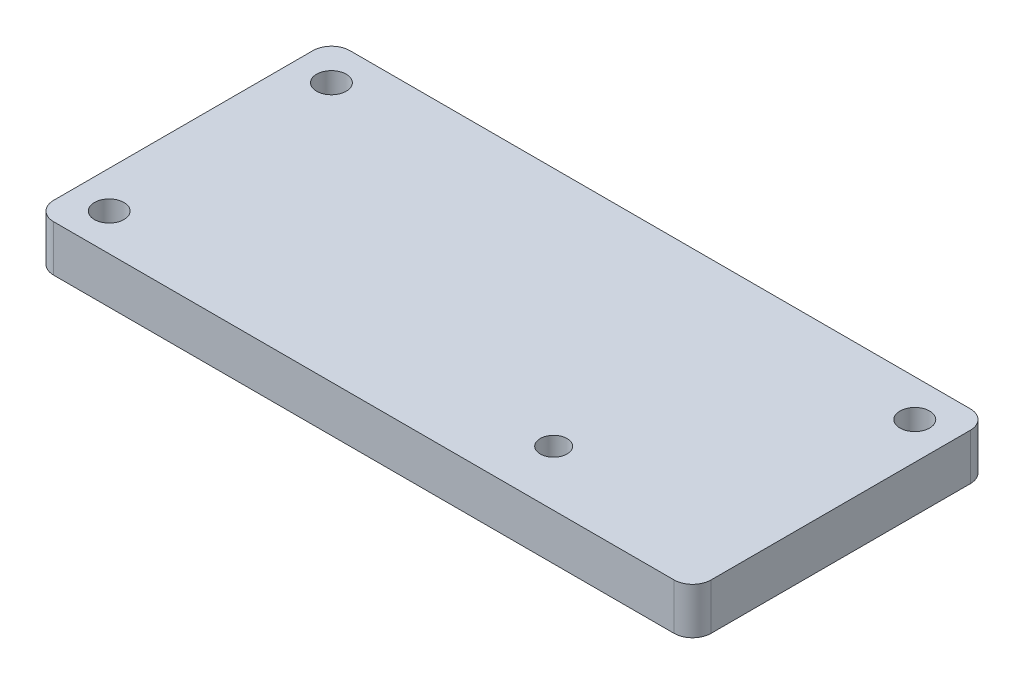
ISO-10303-21;
HEADER;
FILE_DESCRIPTION(('STEP AP214'),'2;1');
FILE_NAME('part.step','',(''),(''),'','','');
FILE_SCHEMA(('AUTOMOTIVE_DESIGN { 1 0 10303 214 1 1 1 1 }'));
ENDSEC;
DATA;
#1=APPLICATION_CONTEXT('core data for automotive mechanical design processes');
#2=APPLICATION_PROTOCOL_DEFINITION('international standard','automotive_design',2000,#1);
#3=PRODUCT_CONTEXT('',#1,'mechanical');
#4=PRODUCT('Part','Part','',(#3));
#5=PRODUCT_RELATED_PRODUCT_CATEGORY('part','',(#4));
#6=PRODUCT_DEFINITION_FORMATION('','',#4);
#7=PRODUCT_DEFINITION_CONTEXT('part definition',#1,'design');
#8=PRODUCT_DEFINITION('design','',#6,#7);
#9=PRODUCT_DEFINITION_SHAPE('','',#8);
#10=(LENGTH_UNIT() NAMED_UNIT(*) SI_UNIT(.MILLI.,.METRE.));
#11=(NAMED_UNIT(*) PLANE_ANGLE_UNIT() SI_UNIT($,.RADIAN.));
#12=(NAMED_UNIT(*) SI_UNIT($,.STERADIAN.) SOLID_ANGLE_UNIT());
#13=UNCERTAINTY_MEASURE_WITH_UNIT(LENGTH_MEASURE(1.E-05),#10,'distance_accuracy_value','');
#14=(GEOMETRIC_REPRESENTATION_CONTEXT(3) GLOBAL_UNCERTAINTY_ASSIGNED_CONTEXT((#13)) GLOBAL_UNIT_ASSIGNED_CONTEXT((#10,
#11,#12)) REPRESENTATION_CONTEXT('',''));
#15=CARTESIAN_POINT('',(0.,0.,0.));
#16=DIRECTION('',(0.,0.,1.));
#17=DIRECTION('',(1.,0.,0.));
#18=AXIS2_PLACEMENT_3D('',#15,#16,#17);
#19=CARTESIAN_POINT('',(0.,5.,0.));
#20=DIRECTION('',(0.,-1.,0.));
#21=DIRECTION('',(0.,0.,-1.));
#22=AXIS2_PLACEMENT_3D('',#19,#20,#21);
#23=PLANE('',#22);
#24=CARTESIAN_POINT('',(31.5,5.,-12.));
#25=DIRECTION('',(0.,1.,0.));
#26=DIRECTION('',(0.,0.,1.));
#27=AXIS2_PLACEMENT_3D('',#24,#25,#26);
#28=CIRCLE('',#27,1.6);
#29=CARTESIAN_POINT('',(31.5,5.,-10.4));
#30=VERTEX_POINT('',#29);
#31=EDGE_CURVE('E230',#30,#30,#28,.T.);
#32=ORIENTED_EDGE('',*,*,#31,.F.);
#33=EDGE_LOOP('',(#32));
#34=FACE_BOUND('',#33,.T.);
#35=CARTESIAN_POINT('',(-31.5,5.,12.));
#36=DIRECTION('',(0.,1.,0.));
#37=DIRECTION('',(0.,0.,1.));
#38=AXIS2_PLACEMENT_3D('',#35,#36,#37);
#39=CIRCLE('',#38,1.6);
#40=CARTESIAN_POINT('',(-31.5,5.,13.6));
#41=VERTEX_POINT('',#40);
#42=EDGE_CURVE('E218',#41,#41,#39,.T.);
#43=ORIENTED_EDGE('',*,*,#42,.F.);
#44=EDGE_LOOP('',(#43));
#45=FACE_BOUND('',#44,.T.);
#46=CARTESIAN_POINT('',(-31.5,5.,-12.));
#47=DIRECTION('',(0.,1.,0.));
#48=DIRECTION('',(0.,0.,1.));
#49=AXIS2_PLACEMENT_3D('',#46,#47,#48);
#50=CIRCLE('',#49,1.6);
#51=CARTESIAN_POINT('',(-31.5,5.,-10.4));
#52=VERTEX_POINT('',#51);
#53=EDGE_CURVE('E213',#52,#52,#50,.T.);
#54=ORIENTED_EDGE('',*,*,#53,.F.);
#55=EDGE_LOOP('',(#54));
#56=FACE_BOUND('',#55,.T.);
#57=DIRECTION('',(1.,0.,0.));
#58=VECTOR('',#57,1.);
#59=CARTESIAN_POINT('',(-35.5,5.,16.));
#60=LINE('',#59,#58);
#61=CARTESIAN_POINT('',(-33.5,5.,16.));
#62=VERTEX_POINT('',#61);
#63=CARTESIAN_POINT('',(33.5,5.,16.));
#64=VERTEX_POINT('',#63);
#65=EDGE_CURVE('E149',#62,#64,#60,.T.);
#66=ORIENTED_EDGE('',*,*,#65,.T.);
#67=CARTESIAN_POINT('',(33.5,5.,14.));
#68=DIRECTION('',(0.,-1.,0.));
#69=DIRECTION('',(0.,0.,-1.));
#70=AXIS2_PLACEMENT_3D('',#67,#68,#69);
#71=CIRCLE('',#70,2.);
#72=CARTESIAN_POINT('',(35.5,5.,14.));
#73=VERTEX_POINT('',#72);
#74=EDGE_CURVE('E172',#64,#73,#71,.F.);
#75=ORIENTED_EDGE('',*,*,#74,.T.);
#76=DIRECTION('',(0.,0.,-1.));
#77=VECTOR('',#76,1.);
#78=CARTESIAN_POINT('',(35.5,5.,16.));
#79=LINE('',#78,#77);
#80=CARTESIAN_POINT('',(35.5,5.,-14.));
#81=VERTEX_POINT('',#80);
#82=EDGE_CURVE('E132',#73,#81,#79,.T.);
#83=ORIENTED_EDGE('',*,*,#82,.T.);
#84=CARTESIAN_POINT('',(33.5,5.,-14.));
#85=DIRECTION('',(0.,-1.,0.));
#86=DIRECTION('',(0.,0.,-1.));
#87=AXIS2_PLACEMENT_3D('',#84,#85,#86);
#88=CIRCLE('',#87,2.);
#89=CARTESIAN_POINT('',(33.5,5.,-16.));
#90=VERTEX_POINT('',#89);
#91=EDGE_CURVE('E169',#81,#90,#88,.F.);
#92=ORIENTED_EDGE('',*,*,#91,.T.);
#93=DIRECTION('',(-1.,0.,0.));
#94=VECTOR('',#93,1.);
#95=CARTESIAN_POINT('',(-35.5,5.,-16.));
#96=LINE('',#95,#94);
#97=CARTESIAN_POINT('',(-33.5,5.,-16.));
#98=VERTEX_POINT('',#97);
#99=EDGE_CURVE('E184',#90,#98,#96,.T.);
#100=ORIENTED_EDGE('',*,*,#99,.T.);
#101=CARTESIAN_POINT('',(-33.5,5.,-14.));
#102=DIRECTION('',(0.,-1.,0.));
#103=DIRECTION('',(0.,0.,-1.));
#104=AXIS2_PLACEMENT_3D('',#101,#102,#103);
#105=CIRCLE('',#104,2.);
#106=CARTESIAN_POINT('',(-35.5,5.,-14.));
#107=VERTEX_POINT('',#106);
#108=EDGE_CURVE('E67',#98,#107,#105,.F.);
#109=ORIENTED_EDGE('',*,*,#108,.T.);
#110=DIRECTION('',(0.,0.,1.));
#111=VECTOR('',#110,1.);
#112=CARTESIAN_POINT('',(-35.5,5.,16.));
#113=LINE('',#112,#111);
#114=CARTESIAN_POINT('',(-35.5,5.,14.));
#115=VERTEX_POINT('',#114);
#116=EDGE_CURVE('E192',#107,#115,#113,.T.);
#117=ORIENTED_EDGE('',*,*,#116,.T.);
#118=CARTESIAN_POINT('',(-33.5,5.,14.));
#119=DIRECTION('',(0.,-1.,0.));
#120=DIRECTION('',(0.,0.,-1.));
#121=AXIS2_PLACEMENT_3D('',#118,#119,#120);
#122=CIRCLE('',#121,2.);
#123=EDGE_CURVE('E164',#115,#62,#122,.F.);
#124=ORIENTED_EDGE('',*,*,#123,.T.);
#125=EDGE_LOOP('',(#66,#75,#83,#92,#100,#109,#117,#124));
#126=FACE_BOUND('',#125,.T.);
#127=CARTESIAN_POINT('',(14.5,5.,10.));
#128=DIRECTION('',(0.,1.,0.));
#129=DIRECTION('',(0.,0.,1.));
#130=AXIS2_PLACEMENT_3D('',#127,#128,#129);
#131=CIRCLE('',#130,1.45);
#132=CARTESIAN_POINT('',(14.5,5.,11.45));
#133=VERTEX_POINT('',#132);
#134=EDGE_CURVE('E140',#133,#133,#131,.T.);
#135=ORIENTED_EDGE('',*,*,#134,.F.);
#136=EDGE_LOOP('',(#135));
#137=FACE_BOUND('',#136,.T.);
#138=ADVANCED_FACE('F46',(#34,#45,#56,#126,#137),#23,.F.);
#139=CARTESIAN_POINT('',(0.,0.,0.));
#140=DIRECTION('',(0.,-1.,0.));
#141=DIRECTION('',(0.,0.,-1.));
#142=AXIS2_PLACEMENT_3D('',#139,#140,#141);
#143=PLANE('',#142);
#144=CARTESIAN_POINT('',(31.5,0.,-12.));
#145=DIRECTION('',(0.,1.,0.));
#146=DIRECTION('',(0.,0.,1.));
#147=AXIS2_PLACEMENT_3D('',#144,#145,#146);
#148=CIRCLE('',#147,1.6);
#149=CARTESIAN_POINT('',(31.5,0.,-10.4));
#150=VERTEX_POINT('',#149);
#151=EDGE_CURVE('E234',#150,#150,#148,.T.);
#152=ORIENTED_EDGE('',*,*,#151,.T.);
#153=EDGE_LOOP('',(#152));
#154=FACE_BOUND('',#153,.T.);
#155=CARTESIAN_POINT('',(-31.5,0.,12.));
#156=DIRECTION('',(0.,1.,0.));
#157=DIRECTION('',(0.,0.,1.));
#158=AXIS2_PLACEMENT_3D('',#155,#156,#157);
#159=CIRCLE('',#158,1.6);
#160=CARTESIAN_POINT('',(-31.5,0.,13.6));
#161=VERTEX_POINT('',#160);
#162=EDGE_CURVE('E228',#161,#161,#159,.T.);
#163=ORIENTED_EDGE('',*,*,#162,.T.);
#164=EDGE_LOOP('',(#163));
#165=FACE_BOUND('',#164,.T.);
#166=CARTESIAN_POINT('',(-31.5,0.,-12.));
#167=DIRECTION('',(0.,1.,0.));
#168=DIRECTION('',(0.,0.,1.));
#169=AXIS2_PLACEMENT_3D('',#166,#167,#168);
#170=CIRCLE('',#169,1.6);
#171=CARTESIAN_POINT('',(-31.5,0.,-10.4));
#172=VERTEX_POINT('',#171);
#173=EDGE_CURVE('E210',#172,#172,#170,.T.);
#174=ORIENTED_EDGE('',*,*,#173,.T.);
#175=EDGE_LOOP('',(#174));
#176=FACE_BOUND('',#175,.T.);
#177=DIRECTION('',(0.,0.,-1.));
#178=VECTOR('',#177,1.);
#179=CARTESIAN_POINT('',(35.5,0.,16.));
#180=LINE('',#179,#178);
#181=CARTESIAN_POINT('',(35.5,0.,14.));
#182=VERTEX_POINT('',#181);
#183=CARTESIAN_POINT('',(35.5,0.,-14.));
#184=VERTEX_POINT('',#183);
#185=EDGE_CURVE('E129',#182,#184,#180,.T.);
#186=ORIENTED_EDGE('',*,*,#185,.F.);
#187=CARTESIAN_POINT('',(33.5,0.,14.));
#188=DIRECTION('',(0.,-1.,0.));
#189=DIRECTION('',(0.,0.,-1.));
#190=AXIS2_PLACEMENT_3D('',#187,#188,#189);
#191=CIRCLE('',#190,2.);
#192=CARTESIAN_POINT('',(33.5,0.,16.));
#193=VERTEX_POINT('',#192);
#194=EDGE_CURVE('E112',#182,#193,#191,.T.);
#195=ORIENTED_EDGE('',*,*,#194,.T.);
#196=DIRECTION('',(1.,0.,0.));
#197=VECTOR('',#196,1.);
#198=CARTESIAN_POINT('',(-35.5,0.,16.));
#199=LINE('',#198,#197);
#200=CARTESIAN_POINT('',(-33.5,0.,16.));
#201=VERTEX_POINT('',#200);
#202=EDGE_CURVE('E154',#201,#193,#199,.T.);
#203=ORIENTED_EDGE('',*,*,#202,.F.);
#204=CARTESIAN_POINT('',(-33.5,0.,14.));
#205=DIRECTION('',(0.,-1.,0.));
#206=DIRECTION('',(0.,0.,-1.));
#207=AXIS2_PLACEMENT_3D('',#204,#205,#206);
#208=CIRCLE('',#207,2.);
#209=CARTESIAN_POINT('',(-35.5,0.,14.));
#210=VERTEX_POINT('',#209);
#211=EDGE_CURVE('E133',#201,#210,#208,.T.);
#212=ORIENTED_EDGE('',*,*,#211,.T.);
#213=DIRECTION('',(0.,0.,1.));
#214=VECTOR('',#213,1.);
#215=CARTESIAN_POINT('',(-35.5,0.,16.));
#216=LINE('',#215,#214);
#217=CARTESIAN_POINT('',(-35.5,0.,-14.));
#218=VERTEX_POINT('',#217);
#219=EDGE_CURVE('E143',#218,#210,#216,.T.);
#220=ORIENTED_EDGE('',*,*,#219,.F.);
#221=CARTESIAN_POINT('',(-33.5,0.,-14.));
#222=DIRECTION('',(0.,-1.,0.));
#223=DIRECTION('',(0.,0.,-1.));
#224=AXIS2_PLACEMENT_3D('',#221,#222,#223);
#225=CIRCLE('',#224,2.);
#226=CARTESIAN_POINT('',(-33.5,0.,-16.));
#227=VERTEX_POINT('',#226);
#228=EDGE_CURVE('E158',#218,#227,#225,.T.);
#229=ORIENTED_EDGE('',*,*,#228,.T.);
#230=DIRECTION('',(-1.,0.,0.));
#231=VECTOR('',#230,1.);
#232=CARTESIAN_POINT('',(-35.5,0.,-16.));
#233=LINE('',#232,#231);
#234=CARTESIAN_POINT('',(33.5,0.,-16.));
#235=VERTEX_POINT('',#234);
#236=EDGE_CURVE('E139',#235,#227,#233,.T.);
#237=ORIENTED_EDGE('',*,*,#236,.F.);
#238=CARTESIAN_POINT('',(33.5,0.,-14.));
#239=DIRECTION('',(0.,-1.,0.));
#240=DIRECTION('',(0.,0.,-1.));
#241=AXIS2_PLACEMENT_3D('',#238,#239,#240);
#242=CIRCLE('',#241,2.);
#243=EDGE_CURVE('E123',#235,#184,#242,.T.);
#244=ORIENTED_EDGE('',*,*,#243,.T.);
#245=EDGE_LOOP('',(#186,#195,#203,#212,#220,#229,#237,#244));
#246=FACE_BOUND('',#245,.T.);
#247=CARTESIAN_POINT('',(14.5,0.,10.));
#248=DIRECTION('',(0.,1.,0.));
#249=DIRECTION('',(0.,0.,1.));
#250=AXIS2_PLACEMENT_3D('',#247,#248,#249);
#251=CIRCLE('',#250,1.45);
#252=CARTESIAN_POINT('',(14.5,0.,11.45));
#253=VERTEX_POINT('',#252);
#254=EDGE_CURVE('E147',#253,#253,#251,.T.);
#255=ORIENTED_EDGE('',*,*,#254,.T.);
#256=EDGE_LOOP('',(#255));
#257=FACE_BOUND('',#256,.T.);
#258=ADVANCED_FACE('F136',(#154,#165,#176,#246,#257),#143,.T.);
#259=CARTESIAN_POINT('',(35.5,5.,16.));
#260=DIRECTION('',(-1.,0.,0.));
#261=DIRECTION('',(0.,0.,1.));
#262=AXIS2_PLACEMENT_3D('',#259,#260,#261);
#263=PLANE('',#262);
#264=ORIENTED_EDGE('',*,*,#82,.F.);
#265=DIRECTION('',(0.,-1.,0.));
#266=VECTOR('',#265,1.);
#267=CARTESIAN_POINT('',(35.5,5.,14.));
#268=LINE('',#267,#266);
#269=EDGE_CURVE('E116',#73,#182,#268,.T.);
#270=ORIENTED_EDGE('',*,*,#269,.T.);
#271=ORIENTED_EDGE('',*,*,#185,.T.);
#272=DIRECTION('',(0.,-1.,0.));
#273=VECTOR('',#272,1.);
#274=CARTESIAN_POINT('',(35.5,5.,-14.));
#275=LINE('',#274,#273);
#276=EDGE_CURVE('E134',#184,#81,#275,.F.);
#277=ORIENTED_EDGE('',*,*,#276,.T.);
#278=EDGE_LOOP('',(#264,#270,#271,#277));
#279=FACE_BOUND('',#278,.T.);
#280=ADVANCED_FACE('F128',(#279),#263,.F.);
#281=CARTESIAN_POINT('',(-35.5,5.,-16.));
#282=DIRECTION('',(0.,0.,1.));
#283=DIRECTION('',(1.,0.,0.));
#284=AXIS2_PLACEMENT_3D('',#281,#282,#283);
#285=PLANE('',#284);
#286=ORIENTED_EDGE('',*,*,#99,.F.);
#287=DIRECTION('',(0.,-1.,0.));
#288=VECTOR('',#287,1.);
#289=CARTESIAN_POINT('',(33.5,5.,-16.));
#290=LINE('',#289,#288);
#291=EDGE_CURVE('E177',#90,#235,#290,.T.);
#292=ORIENTED_EDGE('',*,*,#291,.T.);
#293=ORIENTED_EDGE('',*,*,#236,.T.);
#294=DIRECTION('',(0.,-1.,0.));
#295=VECTOR('',#294,1.);
#296=CARTESIAN_POINT('',(-33.5,5.,-16.));
#297=LINE('',#296,#295);
#298=EDGE_CURVE('E175',#227,#98,#297,.F.);
#299=ORIENTED_EDGE('',*,*,#298,.T.);
#300=EDGE_LOOP('',(#286,#292,#293,#299));
#301=FACE_BOUND('',#300,.T.);
#302=ADVANCED_FACE('F182',(#301),#285,.F.);
#303=CARTESIAN_POINT('',(-35.5,5.,16.));
#304=DIRECTION('',(1.,0.,0.));
#305=DIRECTION('',(0.,0.,-1.));
#306=AXIS2_PLACEMENT_3D('',#303,#304,#305);
#307=PLANE('',#306);
#308=ORIENTED_EDGE('',*,*,#116,.F.);
#309=DIRECTION('',(0.,-1.,0.));
#310=VECTOR('',#309,1.);
#311=CARTESIAN_POINT('',(-35.5,5.,-14.));
#312=LINE('',#311,#310);
#313=EDGE_CURVE('E12',#107,#218,#312,.T.);
#314=ORIENTED_EDGE('',*,*,#313,.T.);
#315=ORIENTED_EDGE('',*,*,#219,.T.);
#316=DIRECTION('',(0.,-1.,0.));
#317=VECTOR('',#316,1.);
#318=CARTESIAN_POINT('',(-35.5,5.,14.));
#319=LINE('',#318,#317);
#320=EDGE_CURVE('E54',#210,#115,#319,.F.);
#321=ORIENTED_EDGE('',*,*,#320,.T.);
#322=EDGE_LOOP('',(#308,#314,#315,#321));
#323=FACE_BOUND('',#322,.T.);
#324=ADVANCED_FACE('F191',(#323),#307,.F.);
#325=CARTESIAN_POINT('',(-35.5,5.,16.));
#326=DIRECTION('',(0.,0.,-1.));
#327=DIRECTION('',(-1.,0.,0.));
#328=AXIS2_PLACEMENT_3D('',#325,#326,#327);
#329=PLANE('',#328);
#330=ORIENTED_EDGE('',*,*,#202,.T.);
#331=DIRECTION('',(0.,-1.,0.));
#332=VECTOR('',#331,1.);
#333=CARTESIAN_POINT('',(33.5,5.,16.));
#334=LINE('',#333,#332);
#335=EDGE_CURVE('E117',#193,#64,#334,.F.);
#336=ORIENTED_EDGE('',*,*,#335,.T.);
#337=ORIENTED_EDGE('',*,*,#65,.F.);
#338=DIRECTION('',(0.,-1.,0.));
#339=VECTOR('',#338,1.);
#340=CARTESIAN_POINT('',(-33.5,5.,16.));
#341=LINE('',#340,#339);
#342=EDGE_CURVE('E122',#62,#201,#341,.T.);
#343=ORIENTED_EDGE('',*,*,#342,.T.);
#344=EDGE_LOOP('',(#330,#336,#337,#343));
#345=FACE_BOUND('',#344,.T.);
#346=ADVANCED_FACE('F261',(#345),#329,.F.);
#347=CARTESIAN_POINT('',(14.5,5.,10.));
#348=DIRECTION('',(0.,-1.,0.));
#349=DIRECTION('',(0.,0.,-1.));
#350=AXIS2_PLACEMENT_3D('',#347,#348,#349);
#351=CYLINDRICAL_SURFACE('',#350,1.45);
#352=ORIENTED_EDGE('',*,*,#134,.T.);
#353=EDGE_LOOP('',(#352));
#354=FACE_BOUND('',#353,.T.);
#355=ORIENTED_EDGE('',*,*,#254,.F.);
#356=EDGE_LOOP('',(#355));
#357=FACE_BOUND('',#356,.T.);
#358=ADVANCED_FACE('F257',(#354,#357),#351,.F.);
#359=CARTESIAN_POINT('',(-31.5,0.,-12.));
#360=DIRECTION('',(0.,1.,0.));
#361=DIRECTION('',(0.,0.,1.));
#362=AXIS2_PLACEMENT_3D('',#359,#360,#361);
#363=CYLINDRICAL_SURFACE('',#362,1.6);
#364=ORIENTED_EDGE('',*,*,#173,.F.);
#365=EDGE_LOOP('',(#364));
#366=FACE_BOUND('',#365,.T.);
#367=ORIENTED_EDGE('',*,*,#53,.T.);
#368=EDGE_LOOP('',(#367));
#369=FACE_BOUND('',#368,.T.);
#370=ADVANCED_FACE('F260',(#366,#369),#363,.F.);
#371=CARTESIAN_POINT('',(-31.5,0.,12.));
#372=DIRECTION('',(0.,1.,0.));
#373=DIRECTION('',(0.,0.,1.));
#374=AXIS2_PLACEMENT_3D('',#371,#372,#373);
#375=CYLINDRICAL_SURFACE('',#374,1.6);
#376=ORIENTED_EDGE('',*,*,#162,.F.);
#377=EDGE_LOOP('',(#376));
#378=FACE_BOUND('',#377,.T.);
#379=ORIENTED_EDGE('',*,*,#42,.T.);
#380=EDGE_LOOP('',(#379));
#381=FACE_BOUND('',#380,.T.);
#382=ADVANCED_FACE('F243',(#378,#381),#375,.F.);
#383=CARTESIAN_POINT('',(31.5,0.,-12.));
#384=DIRECTION('',(0.,1.,0.));
#385=DIRECTION('',(0.,0.,1.));
#386=AXIS2_PLACEMENT_3D('',#383,#384,#385);
#387=CYLINDRICAL_SURFACE('',#386,1.6);
#388=ORIENTED_EDGE('',*,*,#151,.F.);
#389=EDGE_LOOP('',(#388));
#390=FACE_BOUND('',#389,.T.);
#391=ORIENTED_EDGE('',*,*,#31,.T.);
#392=EDGE_LOOP('',(#391));
#393=FACE_BOUND('',#392,.T.);
#394=ADVANCED_FACE('F240',(#390,#393),#387,.F.);
#395=CARTESIAN_POINT('',(33.5,5.,14.));
#396=DIRECTION('',(0.,-1.,0.));
#397=DIRECTION('',(0.,0.,-1.));
#398=AXIS2_PLACEMENT_3D('',#395,#396,#397);
#399=CYLINDRICAL_SURFACE('',#398,2.);
#400=ORIENTED_EDGE('',*,*,#74,.F.);
#401=ORIENTED_EDGE('',*,*,#335,.F.);
#402=ORIENTED_EDGE('',*,*,#194,.F.);
#403=ORIENTED_EDGE('',*,*,#269,.F.);
#404=EDGE_LOOP('',(#400,#401,#402,#403));
#405=FACE_BOUND('',#404,.T.);
#406=ADVANCED_FACE('F115',(#405),#399,.T.);
#407=CARTESIAN_POINT('',(33.5,5.,-14.));
#408=DIRECTION('',(0.,-1.,0.));
#409=DIRECTION('',(0.,0.,-1.));
#410=AXIS2_PLACEMENT_3D('',#407,#408,#409);
#411=CYLINDRICAL_SURFACE('',#410,2.);
#412=ORIENTED_EDGE('',*,*,#91,.F.);
#413=ORIENTED_EDGE('',*,*,#276,.F.);
#414=ORIENTED_EDGE('',*,*,#243,.F.);
#415=ORIENTED_EDGE('',*,*,#291,.F.);
#416=EDGE_LOOP('',(#412,#413,#414,#415));
#417=FACE_BOUND('',#416,.T.);
#418=ADVANCED_FACE('F280',(#417),#411,.T.);
#419=CARTESIAN_POINT('',(-33.5,5.,-14.));
#420=DIRECTION('',(0.,-1.,0.));
#421=DIRECTION('',(0.,0.,-1.));
#422=AXIS2_PLACEMENT_3D('',#419,#420,#421);
#423=CYLINDRICAL_SURFACE('',#422,2.);
#424=ORIENTED_EDGE('',*,*,#108,.F.);
#425=ORIENTED_EDGE('',*,*,#298,.F.);
#426=ORIENTED_EDGE('',*,*,#228,.F.);
#427=ORIENTED_EDGE('',*,*,#313,.F.);
#428=EDGE_LOOP('',(#424,#425,#426,#427));
#429=FACE_BOUND('',#428,.T.);
#430=ADVANCED_FACE('F190',(#429),#423,.T.);
#431=CARTESIAN_POINT('',(-33.5,5.,14.));
#432=DIRECTION('',(0.,-1.,0.));
#433=DIRECTION('',(0.,0.,-1.));
#434=AXIS2_PLACEMENT_3D('',#431,#432,#433);
#435=CYLINDRICAL_SURFACE('',#434,2.);
#436=ORIENTED_EDGE('',*,*,#123,.F.);
#437=ORIENTED_EDGE('',*,*,#320,.F.);
#438=ORIENTED_EDGE('',*,*,#211,.F.);
#439=ORIENTED_EDGE('',*,*,#342,.F.);
#440=EDGE_LOOP('',(#436,#437,#438,#439));
#441=FACE_BOUND('',#440,.T.);
#442=ADVANCED_FACE('F48',(#441),#435,.T.);
#443=CLOSED_SHELL('',(#138,#258,#280,#302,#324,#346,#358,#370,#382,#394,#406,#418,#430,#442));
#444=MANIFOLD_SOLID_BREP('B2',#443);
#445=ADVANCED_BREP_SHAPE_REPRESENTATION('',(#18,#444),#14);
#446=SHAPE_DEFINITION_REPRESENTATION(#9,#445);
ENDSEC;
END-ISO-10303-21;
